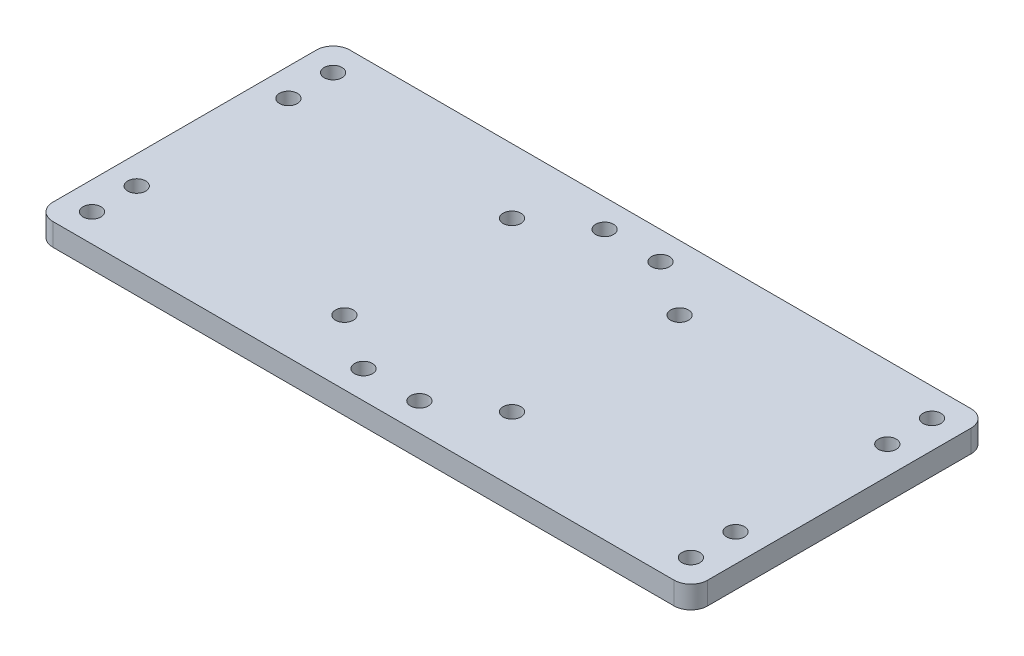
ISO-10303-21;
HEADER;
FILE_DESCRIPTION(('STEP AP214'),'2;1');
FILE_NAME('part.step','',(''),(''),'','','');
FILE_SCHEMA(('AUTOMOTIVE_DESIGN { 1 0 10303 214 1 1 1 1 }'));
ENDSEC;
DATA;
#1=APPLICATION_CONTEXT('core data for automotive mechanical design processes');
#2=APPLICATION_PROTOCOL_DEFINITION('international standard','automotive_design',2000,#1);
#3=PRODUCT_CONTEXT('',#1,'mechanical');
#4=PRODUCT('Part','Part','',(#3));
#5=PRODUCT_RELATED_PRODUCT_CATEGORY('part','',(#4));
#6=PRODUCT_DEFINITION_FORMATION('','',#4);
#7=PRODUCT_DEFINITION_CONTEXT('part definition',#1,'design');
#8=PRODUCT_DEFINITION('design','',#6,#7);
#9=PRODUCT_DEFINITION_SHAPE('','',#8);
#10=(LENGTH_UNIT() NAMED_UNIT(*) SI_UNIT(.MILLI.,.METRE.));
#11=(NAMED_UNIT(*) PLANE_ANGLE_UNIT() SI_UNIT($,.RADIAN.));
#12=(NAMED_UNIT(*) SI_UNIT($,.STERADIAN.) SOLID_ANGLE_UNIT());
#13=UNCERTAINTY_MEASURE_WITH_UNIT(LENGTH_MEASURE(1.E-05),#10,'distance_accuracy_value','');
#14=(GEOMETRIC_REPRESENTATION_CONTEXT(3) GLOBAL_UNCERTAINTY_ASSIGNED_CONTEXT((#13)) GLOBAL_UNIT_ASSIGNED_CONTEXT((#10,
#11,#12)) REPRESENTATION_CONTEXT('',''));
#15=CARTESIAN_POINT('',(0.,0.,0.));
#16=DIRECTION('',(0.,0.,1.));
#17=DIRECTION('',(1.,0.,0.));
#18=AXIS2_PLACEMENT_3D('',#15,#16,#17);
#19=CARTESIAN_POINT('',(58.6,4.,-26.580295875));
#20=DIRECTION('',(-1.,0.,0.));
#21=DIRECTION('',(0.,0.,1.));
#22=AXIS2_PLACEMENT_3D('',#19,#20,#21);
#23=PLANE('',#22);
#24=DIRECTION('',(0.,0.,-1.));
#25=VECTOR('',#24,1.);
#26=CARTESIAN_POINT('',(58.6,4.,-26.580295875));
#27=LINE('',#26,#25);
#28=CARTESIAN_POINT('',(58.6,4.,23.580295875));
#29=VERTEX_POINT('',#28);
#30=CARTESIAN_POINT('',(58.6,4.,-23.580295875));
#31=VERTEX_POINT('',#30);
#32=EDGE_CURVE('E125',#29,#31,#27,.T.);
#33=ORIENTED_EDGE('',*,*,#32,.F.);
#34=DIRECTION('',(0.,-1.,0.));
#35=VECTOR('',#34,1.);
#36=CARTESIAN_POINT('',(58.6,4.,23.580295875));
#37=LINE('',#36,#35);
#38=CARTESIAN_POINT('',(58.6,0.,23.580295875));
#39=VERTEX_POINT('',#38);
#40=EDGE_CURVE('E110',#29,#39,#37,.T.);
#41=ORIENTED_EDGE('',*,*,#40,.T.);
#42=DIRECTION('',(0.,0.,-1.));
#43=VECTOR('',#42,1.);
#44=CARTESIAN_POINT('',(58.6,0.,-26.580295875));
#45=LINE('',#44,#43);
#46=CARTESIAN_POINT('',(58.6,0.,-23.580295875));
#47=VERTEX_POINT('',#46);
#48=EDGE_CURVE('E122',#39,#47,#45,.T.);
#49=ORIENTED_EDGE('',*,*,#48,.T.);
#50=DIRECTION('',(0.,-1.,0.));
#51=VECTOR('',#50,1.);
#52=CARTESIAN_POINT('',(58.6,4.,-23.580295875));
#53=LINE('',#52,#51);
#54=EDGE_CURVE('E127',#47,#31,#53,.F.);
#55=ORIENTED_EDGE('',*,*,#54,.T.);
#56=EDGE_LOOP('',(#33,#41,#49,#55));
#57=FACE_BOUND('',#56,.T.);
#58=ADVANCED_FACE('F38',(#57),#23,.F.);
#59=CARTESIAN_POINT('',(-58.6,4.,-26.580295875));
#60=DIRECTION('',(0.,0.,1.));
#61=DIRECTION('',(1.,0.,0.));
#62=AXIS2_PLACEMENT_3D('',#59,#60,#61);
#63=PLANE('',#62);
#64=DIRECTION('',(-1.,0.,0.));
#65=VECTOR('',#64,1.);
#66=CARTESIAN_POINT('',(-58.6,0.,-26.580295875));
#67=LINE('',#66,#65);
#68=CARTESIAN_POINT('',(55.6,0.,-26.580295875));
#69=VERTEX_POINT('',#68);
#70=CARTESIAN_POINT('',(-55.6,0.,-26.580295875));
#71=VERTEX_POINT('',#70);
#72=EDGE_CURVE('E132',#69,#71,#67,.T.);
#73=ORIENTED_EDGE('',*,*,#72,.T.);
#74=DIRECTION('',(0.,-1.,0.));
#75=VECTOR('',#74,1.);
#76=CARTESIAN_POINT('',(-55.6,4.,-26.580295875));
#77=LINE('',#76,#75);
#78=CARTESIAN_POINT('',(-55.6,4.,-26.580295875));
#79=VERTEX_POINT('',#78);
#80=EDGE_CURVE('E11',#71,#79,#77,.F.);
#81=ORIENTED_EDGE('',*,*,#80,.T.);
#82=DIRECTION('',(-1.,0.,0.));
#83=VECTOR('',#82,1.);
#84=CARTESIAN_POINT('',(-58.6,4.,-26.580295875));
#85=LINE('',#84,#83);
#86=CARTESIAN_POINT('',(55.6,4.,-26.580295875));
#87=VERTEX_POINT('',#86);
#88=EDGE_CURVE('E258',#87,#79,#85,.T.);
#89=ORIENTED_EDGE('',*,*,#88,.F.);
#90=DIRECTION('',(0.,-1.,0.));
#91=VECTOR('',#90,1.);
#92=CARTESIAN_POINT('',(55.6,4.,-26.580295875));
#93=LINE('',#92,#91);
#94=EDGE_CURVE('E47',#87,#69,#93,.T.);
#95=ORIENTED_EDGE('',*,*,#94,.T.);
#96=EDGE_LOOP('',(#73,#81,#89,#95));
#97=FACE_BOUND('',#96,.T.);
#98=ADVANCED_FACE('F275',(#97),#63,.F.);
#99=CARTESIAN_POINT('',(-58.6,4.,-26.580295875));
#100=DIRECTION('',(1.,0.,0.));
#101=DIRECTION('',(0.,0.,-1.));
#102=AXIS2_PLACEMENT_3D('',#99,#100,#101);
#103=PLANE('',#102);
#104=DIRECTION('',(0.,0.,1.));
#105=VECTOR('',#104,1.);
#106=CARTESIAN_POINT('',(-58.6,4.,-26.580295875));
#107=LINE('',#106,#105);
#108=CARTESIAN_POINT('',(-58.6,4.,-23.580295875));
#109=VERTEX_POINT('',#108);
#110=CARTESIAN_POINT('',(-58.6,4.,23.580295875));
#111=VERTEX_POINT('',#110);
#112=EDGE_CURVE('E259',#109,#111,#107,.T.);
#113=ORIENTED_EDGE('',*,*,#112,.F.);
#114=DIRECTION('',(0.,-1.,0.));
#115=VECTOR('',#114,1.);
#116=CARTESIAN_POINT('',(-58.6,4.,-23.580295875));
#117=LINE('',#116,#115);
#118=CARTESIAN_POINT('',(-58.6,0.,-23.580295875));
#119=VERTEX_POINT('',#118);
#120=EDGE_CURVE('E163',#109,#119,#117,.T.);
#121=ORIENTED_EDGE('',*,*,#120,.T.);
#122=DIRECTION('',(0.,0.,1.));
#123=VECTOR('',#122,1.);
#124=CARTESIAN_POINT('',(-58.6,0.,-26.580295875));
#125=LINE('',#124,#123);
#126=CARTESIAN_POINT('',(-58.6,0.,23.580295875));
#127=VERTEX_POINT('',#126);
#128=EDGE_CURVE('E136',#119,#127,#125,.T.);
#129=ORIENTED_EDGE('',*,*,#128,.T.);
#130=DIRECTION('',(0.,-1.,0.));
#131=VECTOR('',#130,1.);
#132=CARTESIAN_POINT('',(-58.6,4.,23.580295875));
#133=LINE('',#132,#131);
#134=EDGE_CURVE('E55',#127,#111,#133,.F.);
#135=ORIENTED_EDGE('',*,*,#134,.T.);
#136=EDGE_LOOP('',(#113,#121,#129,#135));
#137=FACE_BOUND('',#136,.T.);
#138=ADVANCED_FACE('F269',(#137),#103,.F.);
#139=CARTESIAN_POINT('',(-58.6,4.,26.580295875));
#140=DIRECTION('',(0.,0.,-1.));
#141=DIRECTION('',(-1.,0.,0.));
#142=AXIS2_PLACEMENT_3D('',#139,#140,#141);
#143=PLANE('',#142);
#144=DIRECTION('',(1.,0.,0.));
#145=VECTOR('',#144,1.);
#146=CARTESIAN_POINT('',(-58.6,0.,26.580295875));
#147=LINE('',#146,#145);
#148=CARTESIAN_POINT('',(-55.6,0.,26.580295875));
#149=VERTEX_POINT('',#148);
#150=CARTESIAN_POINT('',(55.6,0.,26.580295875));
#151=VERTEX_POINT('',#150);
#152=EDGE_CURVE('E146',#149,#151,#147,.T.);
#153=ORIENTED_EDGE('',*,*,#152,.T.);
#154=DIRECTION('',(0.,-1.,0.));
#155=VECTOR('',#154,1.);
#156=CARTESIAN_POINT('',(55.6,4.,26.580295875));
#157=LINE('',#156,#155);
#158=CARTESIAN_POINT('',(55.6,4.,26.580295875));
#159=VERTEX_POINT('',#158);
#160=EDGE_CURVE('E111',#151,#159,#157,.F.);
#161=ORIENTED_EDGE('',*,*,#160,.T.);
#162=DIRECTION('',(1.,0.,0.));
#163=VECTOR('',#162,1.);
#164=CARTESIAN_POINT('',(-58.6,4.,26.580295875));
#165=LINE('',#164,#163);
#166=CARTESIAN_POINT('',(-55.6,4.,26.580295875));
#167=VERTEX_POINT('',#166);
#168=EDGE_CURVE('E142',#167,#159,#165,.T.);
#169=ORIENTED_EDGE('',*,*,#168,.F.);
#170=DIRECTION('',(0.,-1.,0.));
#171=VECTOR('',#170,1.);
#172=CARTESIAN_POINT('',(-55.6,4.,26.580295875));
#173=LINE('',#172,#171);
#174=EDGE_CURVE('E116',#167,#149,#173,.T.);
#175=ORIENTED_EDGE('',*,*,#174,.T.);
#176=EDGE_LOOP('',(#153,#161,#169,#175));
#177=FACE_BOUND('',#176,.T.);
#178=ADVANCED_FACE('F266',(#177),#143,.F.);
#179=CARTESIAN_POINT('',(0.,4.,0.));
#180=DIRECTION('',(0.,1.,0.));
#181=DIRECTION('',(0.,0.,1.));
#182=AXIS2_PLACEMENT_3D('',#179,#180,#181);
#183=PLANE('',#182);
#184=CARTESIAN_POINT('',(-15.,4.,-15.));
#185=DIRECTION('',(0.,1.,0.));
#186=DIRECTION('',(0.,0.,-1.));
#187=AXIS2_PLACEMENT_3D('',#184,#185,#186);
#188=CIRCLE('',#187,1.6);
#189=CARTESIAN_POINT('',(-15.,4.,-16.6));
#190=VERTEX_POINT('',#189);
#191=EDGE_CURVE('E523',#190,#190,#188,.T.);
#192=ORIENTED_EDGE('',*,*,#191,.F.);
#193=EDGE_LOOP('',(#192));
#194=FACE_BOUND('',#193,.T.);
#195=CARTESIAN_POINT('',(15.,4.,15.));
#196=DIRECTION('',(0.,1.,0.));
#197=DIRECTION('',(0.,0.,1.));
#198=AXIS2_PLACEMENT_3D('',#195,#196,#197);
#199=CIRCLE('',#198,1.60000000000001);
#200=CARTESIAN_POINT('',(15.,4.,16.6));
#201=VERTEX_POINT('',#200);
#202=EDGE_CURVE('E524',#201,#201,#199,.T.);
#203=ORIENTED_EDGE('',*,*,#202,.F.);
#204=EDGE_LOOP('',(#203));
#205=FACE_BOUND('',#204,.T.);
#206=CARTESIAN_POINT('',(15.,4.,-15.));
#207=DIRECTION('',(0.,1.,0.));
#208=DIRECTION('',(0.,0.,-1.));
#209=AXIS2_PLACEMENT_3D('',#206,#207,#208);
#210=CIRCLE('',#209,1.60000000000001);
#211=CARTESIAN_POINT('',(15.,4.,-16.6));
#212=VERTEX_POINT('',#211);
#213=EDGE_CURVE('E176',#212,#212,#210,.T.);
#214=ORIENTED_EDGE('',*,*,#213,.F.);
#215=EDGE_LOOP('',(#214));
#216=FACE_BOUND('',#215,.T.);
#217=CARTESIAN_POINT('',(-15.,4.,15.));
#218=DIRECTION('',(0.,1.,0.));
#219=DIRECTION('',(0.,0.,1.));
#220=AXIS2_PLACEMENT_3D('',#217,#218,#219);
#221=CIRCLE('',#220,1.6);
#222=CARTESIAN_POINT('',(-15.,4.,16.6));
#223=VERTEX_POINT('',#222);
#224=EDGE_CURVE('E172',#223,#223,#221,.T.);
#225=ORIENTED_EDGE('',*,*,#224,.F.);
#226=EDGE_LOOP('',(#225));
#227=FACE_BOUND('',#226,.T.);
#228=CARTESIAN_POINT('',(-53.6,4.,13.580295875));
#229=DIRECTION('',(0.,1.,0.));
#230=DIRECTION('',(0.,0.,1.));
#231=AXIS2_PLACEMENT_3D('',#228,#229,#230);
#232=CIRCLE('',#231,1.6);
#233=CARTESIAN_POINT('',(-53.6,4.,15.180295875));
#234=VERTEX_POINT('',#233);
#235=EDGE_CURVE('E193',#234,#234,#232,.T.);
#236=ORIENTED_EDGE('',*,*,#235,.F.);
#237=EDGE_LOOP('',(#236));
#238=FACE_BOUND('',#237,.T.);
#239=CARTESIAN_POINT('',(-5.,4.,21.580295875));
#240=DIRECTION('',(0.,1.,0.));
#241=DIRECTION('',(0.,0.,1.));
#242=AXIS2_PLACEMENT_3D('',#239,#240,#241);
#243=CIRCLE('',#242,1.6);
#244=CARTESIAN_POINT('',(-5.,4.,23.180295875));
#245=VERTEX_POINT('',#244);
#246=EDGE_CURVE('E199',#245,#245,#243,.T.);
#247=ORIENTED_EDGE('',*,*,#246,.F.);
#248=EDGE_LOOP('',(#247));
#249=FACE_BOUND('',#248,.T.);
#250=CARTESIAN_POINT('',(5.00000000000001,4.,21.580295875));
#251=DIRECTION('',(0.,1.,0.));
#252=DIRECTION('',(0.,0.,-1.));
#253=AXIS2_PLACEMENT_3D('',#250,#251,#252);
#254=CIRCLE('',#253,1.6);
#255=CARTESIAN_POINT('',(5.00000000000001,4.,19.980295875));
#256=VERTEX_POINT('',#255);
#257=EDGE_CURVE('E205',#256,#256,#254,.T.);
#258=ORIENTED_EDGE('',*,*,#257,.F.);
#259=EDGE_LOOP('',(#258));
#260=FACE_BOUND('',#259,.T.);
#261=CARTESIAN_POINT('',(53.6,4.,13.580295875));
#262=DIRECTION('',(0.,1.,0.));
#263=DIRECTION('',(0.,0.,-1.));
#264=AXIS2_PLACEMENT_3D('',#261,#262,#263);
#265=CIRCLE('',#264,1.6);
#266=CARTESIAN_POINT('',(53.6,4.,11.980295875));
#267=VERTEX_POINT('',#266);
#268=EDGE_CURVE('E211',#267,#267,#265,.T.);
#269=ORIENTED_EDGE('',*,*,#268,.F.);
#270=EDGE_LOOP('',(#269));
#271=FACE_BOUND('',#270,.T.);
#272=CARTESIAN_POINT('',(53.6,4.,21.580295875));
#273=DIRECTION('',(0.,1.,0.));
#274=DIRECTION('',(0.,0.,-1.));
#275=AXIS2_PLACEMENT_3D('',#272,#273,#274);
#276=CIRCLE('',#275,1.6);
#277=CARTESIAN_POINT('',(53.6,4.,19.980295875));
#278=VERTEX_POINT('',#277);
#279=EDGE_CURVE('E217',#278,#278,#276,.T.);
#280=ORIENTED_EDGE('',*,*,#279,.F.);
#281=EDGE_LOOP('',(#280));
#282=FACE_BOUND('',#281,.T.);
#283=CARTESIAN_POINT('',(-53.6,4.,-13.580295875));
#284=DIRECTION('',(0.,1.,0.));
#285=DIRECTION('',(0.,0.,-1.));
#286=AXIS2_PLACEMENT_3D('',#283,#284,#285);
#287=CIRCLE('',#286,1.6);
#288=CARTESIAN_POINT('',(-53.6,4.,-15.180295875));
#289=VERTEX_POINT('',#288);
#290=EDGE_CURVE('E223',#289,#289,#287,.T.);
#291=ORIENTED_EDGE('',*,*,#290,.F.);
#292=EDGE_LOOP('',(#291));
#293=FACE_BOUND('',#292,.T.);
#294=CARTESIAN_POINT('',(-53.6,4.,-21.580295875));
#295=DIRECTION('',(0.,1.,0.));
#296=DIRECTION('',(0.,0.,-1.));
#297=AXIS2_PLACEMENT_3D('',#294,#295,#296);
#298=CIRCLE('',#297,1.6);
#299=CARTESIAN_POINT('',(-53.6,4.,-23.180295875));
#300=VERTEX_POINT('',#299);
#301=EDGE_CURVE('E229',#300,#300,#298,.T.);
#302=ORIENTED_EDGE('',*,*,#301,.F.);
#303=EDGE_LOOP('',(#302));
#304=FACE_BOUND('',#303,.T.);
#305=CARTESIAN_POINT('',(-5.,4.,-21.580295875));
#306=DIRECTION('',(0.,1.,0.));
#307=DIRECTION('',(0.,0.,-1.));
#308=AXIS2_PLACEMENT_3D('',#305,#306,#307);
#309=CIRCLE('',#308,1.6);
#310=CARTESIAN_POINT('',(-5.,4.,-23.180295875));
#311=VERTEX_POINT('',#310);
#312=EDGE_CURVE('E235',#311,#311,#309,.T.);
#313=ORIENTED_EDGE('',*,*,#312,.F.);
#314=EDGE_LOOP('',(#313));
#315=FACE_BOUND('',#314,.T.);
#316=CARTESIAN_POINT('',(5.,4.,-21.580295875));
#317=DIRECTION('',(0.,1.,0.));
#318=DIRECTION('',(0.,0.,1.));
#319=AXIS2_PLACEMENT_3D('',#316,#317,#318);
#320=CIRCLE('',#319,1.6);
#321=CARTESIAN_POINT('',(5.,4.,-19.980295875));
#322=VERTEX_POINT('',#321);
#323=EDGE_CURVE('E241',#322,#322,#320,.T.);
#324=ORIENTED_EDGE('',*,*,#323,.F.);
#325=EDGE_LOOP('',(#324));
#326=FACE_BOUND('',#325,.T.);
#327=CARTESIAN_POINT('',(53.6,4.,-21.580295875));
#328=DIRECTION('',(0.,1.,0.));
#329=DIRECTION('',(0.,0.,1.));
#330=AXIS2_PLACEMENT_3D('',#327,#328,#329);
#331=CIRCLE('',#330,1.6);
#332=CARTESIAN_POINT('',(53.6,4.,-19.980295875));
#333=VERTEX_POINT('',#332);
#334=EDGE_CURVE('E247',#333,#333,#331,.T.);
#335=ORIENTED_EDGE('',*,*,#334,.F.);
#336=EDGE_LOOP('',(#335));
#337=FACE_BOUND('',#336,.T.);
#338=CARTESIAN_POINT('',(53.6,4.,-13.580295875));
#339=DIRECTION('',(0.,1.,0.));
#340=DIRECTION('',(0.,0.,1.));
#341=AXIS2_PLACEMENT_3D('',#338,#339,#340);
#342=CIRCLE('',#341,1.59999999999999);
#343=CARTESIAN_POINT('',(53.6,4.,-11.980295875));
#344=VERTEX_POINT('',#343);
#345=EDGE_CURVE('E171',#344,#344,#342,.T.);
#346=ORIENTED_EDGE('',*,*,#345,.F.);
#347=EDGE_LOOP('',(#346));
#348=FACE_BOUND('',#347,.T.);
#349=CARTESIAN_POINT('',(-53.6,4.,21.580295875));
#350=DIRECTION('',(0.,1.,0.));
#351=DIRECTION('',(0.,0.,1.));
#352=AXIS2_PLACEMENT_3D('',#349,#350,#351);
#353=CIRCLE('',#352,1.6);
#354=CARTESIAN_POINT('',(-53.6,4.,23.180295875));
#355=VERTEX_POINT('',#354);
#356=EDGE_CURVE('E139',#355,#355,#353,.T.);
#357=ORIENTED_EDGE('',*,*,#356,.F.);
#358=EDGE_LOOP('',(#357));
#359=FACE_BOUND('',#358,.T.);
#360=ORIENTED_EDGE('',*,*,#168,.T.);
#361=CARTESIAN_POINT('',(55.6,4.,23.580295875));
#362=DIRECTION('',(0.,1.,0.));
#363=DIRECTION('',(0.,0.,1.));
#364=AXIS2_PLACEMENT_3D('',#361,#362,#363);
#365=CIRCLE('',#364,3.);
#366=EDGE_CURVE('E160',#159,#29,#365,.T.);
#367=ORIENTED_EDGE('',*,*,#366,.T.);
#368=ORIENTED_EDGE('',*,*,#32,.T.);
#369=CARTESIAN_POINT('',(55.6,4.,-23.580295875));
#370=DIRECTION('',(0.,1.,0.));
#371=DIRECTION('',(0.,0.,1.));
#372=AXIS2_PLACEMENT_3D('',#369,#370,#371);
#373=CIRCLE('',#372,3.);
#374=EDGE_CURVE('E157',#31,#87,#373,.T.);
#375=ORIENTED_EDGE('',*,*,#374,.T.);
#376=ORIENTED_EDGE('',*,*,#88,.T.);
#377=CARTESIAN_POINT('',(-55.6,4.,-23.580295875));
#378=DIRECTION('',(0.,1.,0.));
#379=DIRECTION('',(0.,0.,1.));
#380=AXIS2_PLACEMENT_3D('',#377,#378,#379);
#381=CIRCLE('',#380,3.);
#382=EDGE_CURVE('E62',#79,#109,#381,.T.);
#383=ORIENTED_EDGE('',*,*,#382,.T.);
#384=ORIENTED_EDGE('',*,*,#112,.T.);
#385=CARTESIAN_POINT('',(-55.6,4.,23.580295875));
#386=DIRECTION('',(0.,1.,0.));
#387=DIRECTION('',(0.,0.,1.));
#388=AXIS2_PLACEMENT_3D('',#385,#386,#387);
#389=CIRCLE('',#388,3.);
#390=EDGE_CURVE('E155',#111,#167,#389,.T.);
#391=ORIENTED_EDGE('',*,*,#390,.T.);
#392=EDGE_LOOP('',(#360,#367,#368,#375,#376,#383,#384,#391));
#393=FACE_BOUND('',#392,.T.);
#394=ADVANCED_FACE('F263',(#194,#205,#216,#227,#238,#249,#260,#271,#282,#293,#304,#315,#326,
#337,#348,#359,#393),#183,.T.);
#395=CARTESIAN_POINT('',(0.,0.,0.));
#396=DIRECTION('',(0.,1.,0.));
#397=DIRECTION('',(0.,0.,1.));
#398=AXIS2_PLACEMENT_3D('',#395,#396,#397);
#399=PLANE('',#398);
#400=CARTESIAN_POINT('',(-15.,0.,-15.));
#401=DIRECTION('',(0.,1.,0.));
#402=DIRECTION('',(0.,0.,1.));
#403=AXIS2_PLACEMENT_3D('',#400,#401,#402);
#404=CIRCLE('',#403,1.6);
#405=CARTESIAN_POINT('',(-15.,0.,-13.4));
#406=VERTEX_POINT('',#405);
#407=EDGE_CURVE('E42',#406,#406,#404,.T.);
#408=ORIENTED_EDGE('',*,*,#407,.T.);
#409=EDGE_LOOP('',(#408));
#410=FACE_BOUND('',#409,.T.);
#411=CARTESIAN_POINT('',(15.,0.,15.));
#412=DIRECTION('',(0.,1.,0.));
#413=DIRECTION('',(0.,0.,1.));
#414=AXIS2_PLACEMENT_3D('',#411,#412,#413);
#415=CIRCLE('',#414,1.60000000000001);
#416=CARTESIAN_POINT('',(15.,0.,16.6));
#417=VERTEX_POINT('',#416);
#418=EDGE_CURVE('E175',#417,#417,#415,.T.);
#419=ORIENTED_EDGE('',*,*,#418,.T.);
#420=EDGE_LOOP('',(#419));
#421=FACE_BOUND('',#420,.T.);
#422=CARTESIAN_POINT('',(15.,0.,-15.));
#423=DIRECTION('',(0.,1.,0.));
#424=DIRECTION('',(0.,0.,1.));
#425=AXIS2_PLACEMENT_3D('',#422,#423,#424);
#426=CIRCLE('',#425,1.60000000000001);
#427=CARTESIAN_POINT('',(15.,0.,-13.4));
#428=VERTEX_POINT('',#427);
#429=EDGE_CURVE('E173',#428,#428,#426,.T.);
#430=ORIENTED_EDGE('',*,*,#429,.T.);
#431=EDGE_LOOP('',(#430));
#432=FACE_BOUND('',#431,.T.);
#433=CARTESIAN_POINT('',(-15.,0.,15.));
#434=DIRECTION('',(0.,1.,0.));
#435=DIRECTION('',(0.,0.,1.));
#436=AXIS2_PLACEMENT_3D('',#433,#434,#435);
#437=CIRCLE('',#436,1.6);
#438=CARTESIAN_POINT('',(-15.,0.,16.6));
#439=VERTEX_POINT('',#438);
#440=EDGE_CURVE('E168',#439,#439,#437,.T.);
#441=ORIENTED_EDGE('',*,*,#440,.T.);
#442=EDGE_LOOP('',(#441));
#443=FACE_BOUND('',#442,.T.);
#444=CARTESIAN_POINT('',(-53.6,0.,13.580295875));
#445=DIRECTION('',(0.,1.,0.));
#446=DIRECTION('',(0.,0.,1.));
#447=AXIS2_PLACEMENT_3D('',#444,#445,#446);
#448=CIRCLE('',#447,1.6);
#449=CARTESIAN_POINT('',(-53.6,0.,15.180295875));
#450=VERTEX_POINT('',#449);
#451=EDGE_CURVE('E190',#450,#450,#448,.T.);
#452=ORIENTED_EDGE('',*,*,#451,.T.);
#453=EDGE_LOOP('',(#452));
#454=FACE_BOUND('',#453,.T.);
#455=CARTESIAN_POINT('',(-5.,0.,21.580295875));
#456=DIRECTION('',(0.,1.,0.));
#457=DIRECTION('',(0.,0.,1.));
#458=AXIS2_PLACEMENT_3D('',#455,#456,#457);
#459=CIRCLE('',#458,1.6);
#460=CARTESIAN_POINT('',(-5.,0.,23.180295875));
#461=VERTEX_POINT('',#460);
#462=EDGE_CURVE('E196',#461,#461,#459,.T.);
#463=ORIENTED_EDGE('',*,*,#462,.T.);
#464=EDGE_LOOP('',(#463));
#465=FACE_BOUND('',#464,.T.);
#466=CARTESIAN_POINT('',(5.00000000000001,0.,21.580295875));
#467=DIRECTION('',(0.,1.,0.));
#468=DIRECTION('',(0.,0.,-1.));
#469=AXIS2_PLACEMENT_3D('',#466,#467,#468);
#470=CIRCLE('',#469,1.6);
#471=CARTESIAN_POINT('',(5.00000000000001,0.,19.980295875));
#472=VERTEX_POINT('',#471);
#473=EDGE_CURVE('E202',#472,#472,#470,.T.);
#474=ORIENTED_EDGE('',*,*,#473,.T.);
#475=EDGE_LOOP('',(#474));
#476=FACE_BOUND('',#475,.T.);
#477=CARTESIAN_POINT('',(53.6,0.,13.580295875));
#478=DIRECTION('',(0.,1.,0.));
#479=DIRECTION('',(0.,0.,-1.));
#480=AXIS2_PLACEMENT_3D('',#477,#478,#479);
#481=CIRCLE('',#480,1.6);
#482=CARTESIAN_POINT('',(53.6,0.,11.980295875));
#483=VERTEX_POINT('',#482);
#484=EDGE_CURVE('E208',#483,#483,#481,.T.);
#485=ORIENTED_EDGE('',*,*,#484,.T.);
#486=EDGE_LOOP('',(#485));
#487=FACE_BOUND('',#486,.T.);
#488=CARTESIAN_POINT('',(53.6,0.,21.580295875));
#489=DIRECTION('',(0.,1.,0.));
#490=DIRECTION('',(0.,0.,-1.));
#491=AXIS2_PLACEMENT_3D('',#488,#489,#490);
#492=CIRCLE('',#491,1.6);
#493=CARTESIAN_POINT('',(53.6,0.,19.980295875));
#494=VERTEX_POINT('',#493);
#495=EDGE_CURVE('E214',#494,#494,#492,.T.);
#496=ORIENTED_EDGE('',*,*,#495,.T.);
#497=EDGE_LOOP('',(#496));
#498=FACE_BOUND('',#497,.T.);
#499=CARTESIAN_POINT('',(-53.6,0.,-13.580295875));
#500=DIRECTION('',(0.,1.,0.));
#501=DIRECTION('',(0.,0.,-1.));
#502=AXIS2_PLACEMENT_3D('',#499,#500,#501);
#503=CIRCLE('',#502,1.6);
#504=CARTESIAN_POINT('',(-53.6,0.,-15.180295875));
#505=VERTEX_POINT('',#504);
#506=EDGE_CURVE('E220',#505,#505,#503,.T.);
#507=ORIENTED_EDGE('',*,*,#506,.T.);
#508=EDGE_LOOP('',(#507));
#509=FACE_BOUND('',#508,.T.);
#510=CARTESIAN_POINT('',(-53.6,0.,-21.580295875));
#511=DIRECTION('',(0.,1.,0.));
#512=DIRECTION('',(0.,0.,-1.));
#513=AXIS2_PLACEMENT_3D('',#510,#511,#512);
#514=CIRCLE('',#513,1.6);
#515=CARTESIAN_POINT('',(-53.6,0.,-23.180295875));
#516=VERTEX_POINT('',#515);
#517=EDGE_CURVE('E226',#516,#516,#514,.T.);
#518=ORIENTED_EDGE('',*,*,#517,.T.);
#519=EDGE_LOOP('',(#518));
#520=FACE_BOUND('',#519,.T.);
#521=CARTESIAN_POINT('',(-5.,0.,-21.580295875));
#522=DIRECTION('',(0.,1.,0.));
#523=DIRECTION('',(0.,0.,-1.));
#524=AXIS2_PLACEMENT_3D('',#521,#522,#523);
#525=CIRCLE('',#524,1.6);
#526=CARTESIAN_POINT('',(-5.,0.,-23.180295875));
#527=VERTEX_POINT('',#526);
#528=EDGE_CURVE('E232',#527,#527,#525,.T.);
#529=ORIENTED_EDGE('',*,*,#528,.T.);
#530=EDGE_LOOP('',(#529));
#531=FACE_BOUND('',#530,.T.);
#532=CARTESIAN_POINT('',(5.,0.,-21.580295875));
#533=DIRECTION('',(0.,1.,0.));
#534=DIRECTION('',(0.,0.,1.));
#535=AXIS2_PLACEMENT_3D('',#532,#533,#534);
#536=CIRCLE('',#535,1.6);
#537=CARTESIAN_POINT('',(5.,0.,-19.980295875));
#538=VERTEX_POINT('',#537);
#539=EDGE_CURVE('E238',#538,#538,#536,.T.);
#540=ORIENTED_EDGE('',*,*,#539,.T.);
#541=EDGE_LOOP('',(#540));
#542=FACE_BOUND('',#541,.T.);
#543=CARTESIAN_POINT('',(53.6,0.,-21.580295875));
#544=DIRECTION('',(0.,1.,0.));
#545=DIRECTION('',(0.,0.,1.));
#546=AXIS2_PLACEMENT_3D('',#543,#544,#545);
#547=CIRCLE('',#546,1.6);
#548=CARTESIAN_POINT('',(53.6,0.,-19.980295875));
#549=VERTEX_POINT('',#548);
#550=EDGE_CURVE('E244',#549,#549,#547,.T.);
#551=ORIENTED_EDGE('',*,*,#550,.T.);
#552=EDGE_LOOP('',(#551));
#553=FACE_BOUND('',#552,.T.);
#554=CARTESIAN_POINT('',(53.6,0.,-13.580295875));
#555=DIRECTION('',(0.,1.,0.));
#556=DIRECTION('',(0.,0.,1.));
#557=AXIS2_PLACEMENT_3D('',#554,#555,#556);
#558=CIRCLE('',#557,1.59999999999999);
#559=CARTESIAN_POINT('',(53.6,0.,-11.980295875));
#560=VERTEX_POINT('',#559);
#561=EDGE_CURVE('E250',#560,#560,#558,.T.);
#562=ORIENTED_EDGE('',*,*,#561,.T.);
#563=EDGE_LOOP('',(#562));
#564=FACE_BOUND('',#563,.T.);
#565=CARTESIAN_POINT('',(-53.6,0.,21.580295875));
#566=DIRECTION('',(0.,1.,0.));
#567=DIRECTION('',(0.,0.,1.));
#568=AXIS2_PLACEMENT_3D('',#565,#566,#567);
#569=CIRCLE('',#568,1.6);
#570=CARTESIAN_POINT('',(-53.6,0.,23.180295875));
#571=VERTEX_POINT('',#570);
#572=EDGE_CURVE('E133',#571,#571,#569,.T.);
#573=ORIENTED_EDGE('',*,*,#572,.T.);
#574=EDGE_LOOP('',(#573));
#575=FACE_BOUND('',#574,.T.);
#576=ORIENTED_EDGE('',*,*,#48,.F.);
#577=CARTESIAN_POINT('',(55.6,0.,23.580295875));
#578=DIRECTION('',(0.,1.,0.));
#579=DIRECTION('',(0.,0.,1.));
#580=AXIS2_PLACEMENT_3D('',#577,#578,#579);
#581=CIRCLE('',#580,3.);
#582=EDGE_CURVE('E106',#39,#151,#581,.F.);
#583=ORIENTED_EDGE('',*,*,#582,.T.);
#584=ORIENTED_EDGE('',*,*,#152,.F.);
#585=CARTESIAN_POINT('',(-55.6,0.,23.580295875));
#586=DIRECTION('',(0.,1.,0.));
#587=DIRECTION('',(0.,0.,1.));
#588=AXIS2_PLACEMENT_3D('',#585,#586,#587);
#589=CIRCLE('',#588,3.);
#590=EDGE_CURVE('E126',#149,#127,#589,.F.);
#591=ORIENTED_EDGE('',*,*,#590,.T.);
#592=ORIENTED_EDGE('',*,*,#128,.F.);
#593=CARTESIAN_POINT('',(-55.6,0.,-23.580295875));
#594=DIRECTION('',(0.,1.,0.));
#595=DIRECTION('',(0.,0.,1.));
#596=AXIS2_PLACEMENT_3D('',#593,#594,#595);
#597=CIRCLE('',#596,3.);
#598=EDGE_CURVE('E117',#119,#71,#597,.F.);
#599=ORIENTED_EDGE('',*,*,#598,.T.);
#600=ORIENTED_EDGE('',*,*,#72,.F.);
#601=CARTESIAN_POINT('',(55.6,0.,-23.580295875));
#602=DIRECTION('',(0.,1.,0.));
#603=DIRECTION('',(0.,0.,1.));
#604=AXIS2_PLACEMENT_3D('',#601,#602,#603);
#605=CIRCLE('',#604,3.);
#606=EDGE_CURVE('E131',#69,#47,#605,.F.);
#607=ORIENTED_EDGE('',*,*,#606,.T.);
#608=EDGE_LOOP('',(#576,#583,#584,#591,#592,#599,#600,#607));
#609=FACE_BOUND('',#608,.T.);
#610=ADVANCED_FACE('F129',(#410,#421,#432,#443,#454,#465,#476,#487,#498,#509,#520,#531,#542,
#553,#564,#575,#609),#399,.F.);
#611=CARTESIAN_POINT('',(-53.6,0.,21.580295875));
#612=DIRECTION('',(0.,1.,0.));
#613=DIRECTION('',(0.,0.,1.));
#614=AXIS2_PLACEMENT_3D('',#611,#612,#613);
#615=CYLINDRICAL_SURFACE('',#614,1.6);
#616=ORIENTED_EDGE('',*,*,#572,.F.);
#617=EDGE_LOOP('',(#616));
#618=FACE_BOUND('',#617,.T.);
#619=ORIENTED_EDGE('',*,*,#356,.T.);
#620=EDGE_LOOP('',(#619));
#621=FACE_BOUND('',#620,.T.);
#622=ADVANCED_FACE('F349',(#618,#621),#615,.F.);
#623=CARTESIAN_POINT('',(53.6,0.,-13.580295875));
#624=DIRECTION('',(0.,1.,0.));
#625=DIRECTION('',(0.,0.,1.));
#626=AXIS2_PLACEMENT_3D('',#623,#624,#625);
#627=CYLINDRICAL_SURFACE('',#626,1.59999999999999);
#628=ORIENTED_EDGE('',*,*,#561,.F.);
#629=EDGE_LOOP('',(#628));
#630=FACE_BOUND('',#629,.T.);
#631=ORIENTED_EDGE('',*,*,#345,.T.);
#632=EDGE_LOOP('',(#631));
#633=FACE_BOUND('',#632,.T.);
#634=ADVANCED_FACE('F345',(#630,#633),#627,.F.);
#635=CARTESIAN_POINT('',(53.6,0.,-21.580295875));
#636=DIRECTION('',(0.,1.,0.));
#637=DIRECTION('',(0.,0.,1.));
#638=AXIS2_PLACEMENT_3D('',#635,#636,#637);
#639=CYLINDRICAL_SURFACE('',#638,1.6);
#640=ORIENTED_EDGE('',*,*,#550,.F.);
#641=EDGE_LOOP('',(#640));
#642=FACE_BOUND('',#641,.T.);
#643=ORIENTED_EDGE('',*,*,#334,.T.);
#644=EDGE_LOOP('',(#643));
#645=FACE_BOUND('',#644,.T.);
#646=ADVANCED_FACE('F341',(#642,#645),#639,.F.);
#647=CARTESIAN_POINT('',(5.,0.,-21.580295875));
#648=DIRECTION('',(0.,1.,0.));
#649=DIRECTION('',(0.,0.,1.));
#650=AXIS2_PLACEMENT_3D('',#647,#648,#649);
#651=CYLINDRICAL_SURFACE('',#650,1.6);
#652=ORIENTED_EDGE('',*,*,#539,.F.);
#653=EDGE_LOOP('',(#652));
#654=FACE_BOUND('',#653,.T.);
#655=ORIENTED_EDGE('',*,*,#323,.T.);
#656=EDGE_LOOP('',(#655));
#657=FACE_BOUND('',#656,.T.);
#658=ADVANCED_FACE('F337',(#654,#657),#651,.F.);
#659=CARTESIAN_POINT('',(-5.,0.,-21.580295875));
#660=DIRECTION('',(0.,1.,0.));
#661=DIRECTION('',(0.,0.,1.));
#662=AXIS2_PLACEMENT_3D('',#659,#660,#661);
#663=CYLINDRICAL_SURFACE('',#662,1.6);
#664=ORIENTED_EDGE('',*,*,#528,.F.);
#665=EDGE_LOOP('',(#664));
#666=FACE_BOUND('',#665,.T.);
#667=ORIENTED_EDGE('',*,*,#312,.T.);
#668=EDGE_LOOP('',(#667));
#669=FACE_BOUND('',#668,.T.);
#670=ADVANCED_FACE('F333',(#666,#669),#663,.F.);
#671=CARTESIAN_POINT('',(-53.6,0.,-21.580295875));
#672=DIRECTION('',(0.,1.,0.));
#673=DIRECTION('',(0.,0.,1.));
#674=AXIS2_PLACEMENT_3D('',#671,#672,#673);
#675=CYLINDRICAL_SURFACE('',#674,1.6);
#676=ORIENTED_EDGE('',*,*,#517,.F.);
#677=EDGE_LOOP('',(#676));
#678=FACE_BOUND('',#677,.T.);
#679=ORIENTED_EDGE('',*,*,#301,.T.);
#680=EDGE_LOOP('',(#679));
#681=FACE_BOUND('',#680,.T.);
#682=ADVANCED_FACE('F329',(#678,#681),#675,.F.);
#683=CARTESIAN_POINT('',(-53.6,0.,-13.580295875));
#684=DIRECTION('',(0.,1.,0.));
#685=DIRECTION('',(0.,0.,1.));
#686=AXIS2_PLACEMENT_3D('',#683,#684,#685);
#687=CYLINDRICAL_SURFACE('',#686,1.6);
#688=ORIENTED_EDGE('',*,*,#506,.F.);
#689=EDGE_LOOP('',(#688));
#690=FACE_BOUND('',#689,.T.);
#691=ORIENTED_EDGE('',*,*,#290,.T.);
#692=EDGE_LOOP('',(#691));
#693=FACE_BOUND('',#692,.T.);
#694=ADVANCED_FACE('F325',(#690,#693),#687,.F.);
#695=CARTESIAN_POINT('',(53.6,0.,21.580295875));
#696=DIRECTION('',(0.,1.,0.));
#697=DIRECTION('',(0.,0.,1.));
#698=AXIS2_PLACEMENT_3D('',#695,#696,#697);
#699=CYLINDRICAL_SURFACE('',#698,1.6);
#700=ORIENTED_EDGE('',*,*,#495,.F.);
#701=EDGE_LOOP('',(#700));
#702=FACE_BOUND('',#701,.T.);
#703=ORIENTED_EDGE('',*,*,#279,.T.);
#704=EDGE_LOOP('',(#703));
#705=FACE_BOUND('',#704,.T.);
#706=ADVANCED_FACE('F321',(#702,#705),#699,.F.);
#707=CARTESIAN_POINT('',(53.6,0.,13.580295875));
#708=DIRECTION('',(0.,1.,0.));
#709=DIRECTION('',(0.,0.,1.));
#710=AXIS2_PLACEMENT_3D('',#707,#708,#709);
#711=CYLINDRICAL_SURFACE('',#710,1.6);
#712=ORIENTED_EDGE('',*,*,#484,.F.);
#713=EDGE_LOOP('',(#712));
#714=FACE_BOUND('',#713,.T.);
#715=ORIENTED_EDGE('',*,*,#268,.T.);
#716=EDGE_LOOP('',(#715));
#717=FACE_BOUND('',#716,.T.);
#718=ADVANCED_FACE('F317',(#714,#717),#711,.F.);
#719=CARTESIAN_POINT('',(5.00000000000001,0.,21.580295875));
#720=DIRECTION('',(0.,1.,0.));
#721=DIRECTION('',(0.,0.,1.));
#722=AXIS2_PLACEMENT_3D('',#719,#720,#721);
#723=CYLINDRICAL_SURFACE('',#722,1.6);
#724=ORIENTED_EDGE('',*,*,#473,.F.);
#725=EDGE_LOOP('',(#724));
#726=FACE_BOUND('',#725,.T.);
#727=ORIENTED_EDGE('',*,*,#257,.T.);
#728=EDGE_LOOP('',(#727));
#729=FACE_BOUND('',#728,.T.);
#730=ADVANCED_FACE('F307',(#726,#729),#723,.F.);
#731=CARTESIAN_POINT('',(-5.,0.,21.580295875));
#732=DIRECTION('',(0.,1.,0.));
#733=DIRECTION('',(0.,0.,1.));
#734=AXIS2_PLACEMENT_3D('',#731,#732,#733);
#735=CYLINDRICAL_SURFACE('',#734,1.6);
#736=ORIENTED_EDGE('',*,*,#462,.F.);
#737=EDGE_LOOP('',(#736));
#738=FACE_BOUND('',#737,.T.);
#739=ORIENTED_EDGE('',*,*,#246,.T.);
#740=EDGE_LOOP('',(#739));
#741=FACE_BOUND('',#740,.T.);
#742=ADVANCED_FACE('F301',(#738,#741),#735,.F.);
#743=CARTESIAN_POINT('',(-53.6,0.,13.580295875));
#744=DIRECTION('',(0.,1.,0.));
#745=DIRECTION('',(0.,0.,1.));
#746=AXIS2_PLACEMENT_3D('',#743,#744,#745);
#747=CYLINDRICAL_SURFACE('',#746,1.6);
#748=ORIENTED_EDGE('',*,*,#451,.F.);
#749=EDGE_LOOP('',(#748));
#750=FACE_BOUND('',#749,.T.);
#751=ORIENTED_EDGE('',*,*,#235,.T.);
#752=EDGE_LOOP('',(#751));
#753=FACE_BOUND('',#752,.T.);
#754=ADVANCED_FACE('F297',(#750,#753),#747,.F.);
#755=CARTESIAN_POINT('',(55.6,4.,23.580295875));
#756=DIRECTION('',(0.,-1.,0.));
#757=DIRECTION('',(0.,0.,-1.));
#758=AXIS2_PLACEMENT_3D('',#755,#756,#757);
#759=CYLINDRICAL_SURFACE('',#758,3.);
#760=ORIENTED_EDGE('',*,*,#366,.F.);
#761=ORIENTED_EDGE('',*,*,#160,.F.);
#762=ORIENTED_EDGE('',*,*,#582,.F.);
#763=ORIENTED_EDGE('',*,*,#40,.F.);
#764=EDGE_LOOP('',(#760,#761,#762,#763));
#765=FACE_BOUND('',#764,.T.);
#766=ADVANCED_FACE('F109',(#765),#759,.T.);
#767=CARTESIAN_POINT('',(-55.6,4.,-23.580295875));
#768=DIRECTION('',(0.,-1.,0.));
#769=DIRECTION('',(0.,0.,-1.));
#770=AXIS2_PLACEMENT_3D('',#767,#768,#769);
#771=CYLINDRICAL_SURFACE('',#770,3.);
#772=ORIENTED_EDGE('',*,*,#382,.F.);
#773=ORIENTED_EDGE('',*,*,#80,.F.);
#774=ORIENTED_EDGE('',*,*,#598,.F.);
#775=ORIENTED_EDGE('',*,*,#120,.F.);
#776=EDGE_LOOP('',(#772,#773,#774,#775));
#777=FACE_BOUND('',#776,.T.);
#778=ADVANCED_FACE('F272',(#777),#771,.T.);
#779=CARTESIAN_POINT('',(55.6,4.,-23.580295875));
#780=DIRECTION('',(0.,-1.,0.));
#781=DIRECTION('',(0.,0.,-1.));
#782=AXIS2_PLACEMENT_3D('',#779,#780,#781);
#783=CYLINDRICAL_SURFACE('',#782,3.);
#784=ORIENTED_EDGE('',*,*,#374,.F.);
#785=ORIENTED_EDGE('',*,*,#54,.F.);
#786=ORIENTED_EDGE('',*,*,#606,.F.);
#787=ORIENTED_EDGE('',*,*,#94,.F.);
#788=EDGE_LOOP('',(#784,#785,#786,#787));
#789=FACE_BOUND('',#788,.T.);
#790=ADVANCED_FACE('F280',(#789),#783,.T.);
#791=CARTESIAN_POINT('',(-55.6,4.,23.580295875));
#792=DIRECTION('',(0.,-1.,0.));
#793=DIRECTION('',(0.,0.,-1.));
#794=AXIS2_PLACEMENT_3D('',#791,#792,#793);
#795=CYLINDRICAL_SURFACE('',#794,3.);
#796=ORIENTED_EDGE('',*,*,#390,.F.);
#797=ORIENTED_EDGE('',*,*,#134,.F.);
#798=ORIENTED_EDGE('',*,*,#590,.F.);
#799=ORIENTED_EDGE('',*,*,#174,.F.);
#800=EDGE_LOOP('',(#796,#797,#798,#799));
#801=FACE_BOUND('',#800,.T.);
#802=ADVANCED_FACE('F40',(#801),#795,.T.);
#803=CARTESIAN_POINT('',(-15.,-6.,15.));
#804=DIRECTION('',(0.,1.,0.));
#805=DIRECTION('',(0.,0.,1.));
#806=AXIS2_PLACEMENT_3D('',#803,#804,#805);
#807=CYLINDRICAL_SURFACE('',#806,1.6);
#808=ORIENTED_EDGE('',*,*,#224,.T.);
#809=EDGE_LOOP('',(#808));
#810=FACE_BOUND('',#809,.T.);
#811=ORIENTED_EDGE('',*,*,#440,.F.);
#812=EDGE_LOOP('',(#811));
#813=FACE_BOUND('',#812,.T.);
#814=ADVANCED_FACE('F286',(#810,#813),#807,.F.);
#815=CARTESIAN_POINT('',(15.,-6.,-15.));
#816=DIRECTION('',(0.,1.,0.));
#817=DIRECTION('',(0.,0.,1.));
#818=AXIS2_PLACEMENT_3D('',#815,#816,#817);
#819=CYLINDRICAL_SURFACE('',#818,1.60000000000001);
#820=ORIENTED_EDGE('',*,*,#213,.T.);
#821=EDGE_LOOP('',(#820));
#822=FACE_BOUND('',#821,.T.);
#823=ORIENTED_EDGE('',*,*,#429,.F.);
#824=EDGE_LOOP('',(#823));
#825=FACE_BOUND('',#824,.T.);
#826=ADVANCED_FACE('F489',(#822,#825),#819,.F.);
#827=CARTESIAN_POINT('',(15.,-6.,15.));
#828=DIRECTION('',(0.,1.,0.));
#829=DIRECTION('',(0.,0.,1.));
#830=AXIS2_PLACEMENT_3D('',#827,#828,#829);
#831=CYLINDRICAL_SURFACE('',#830,1.60000000000001);
#832=ORIENTED_EDGE('',*,*,#202,.T.);
#833=EDGE_LOOP('',(#832));
#834=FACE_BOUND('',#833,.T.);
#835=ORIENTED_EDGE('',*,*,#418,.F.);
#836=EDGE_LOOP('',(#835));
#837=FACE_BOUND('',#836,.T.);
#838=ADVANCED_FACE('F496',(#834,#837),#831,.F.);
#839=CARTESIAN_POINT('',(-15.,-6.,-15.));
#840=DIRECTION('',(0.,1.,0.));
#841=DIRECTION('',(0.,0.,1.));
#842=AXIS2_PLACEMENT_3D('',#839,#840,#841);
#843=CYLINDRICAL_SURFACE('',#842,1.6);
#844=ORIENTED_EDGE('',*,*,#191,.T.);
#845=EDGE_LOOP('',(#844));
#846=FACE_BOUND('',#845,.T.);
#847=ORIENTED_EDGE('',*,*,#407,.F.);
#848=EDGE_LOOP('',(#847));
#849=FACE_BOUND('',#848,.T.);
#850=ADVANCED_FACE('F504',(#846,#849),#843,.F.);
#851=CLOSED_SHELL('',(#58,#98,#138,#178,#394,#610,#622,#634,#646,#658,#670,#682,#694,#706,#718,
#730,#742,#754,#766,#778,#790,#802,#814,#826,#838,#850));
#852=MANIFOLD_SOLID_BREP('B2',#851);
#853=ADVANCED_BREP_SHAPE_REPRESENTATION('',(#18,#852),#14);
#854=SHAPE_DEFINITION_REPRESENTATION(#9,#853);
ENDSEC;
END-ISO-10303-21;
